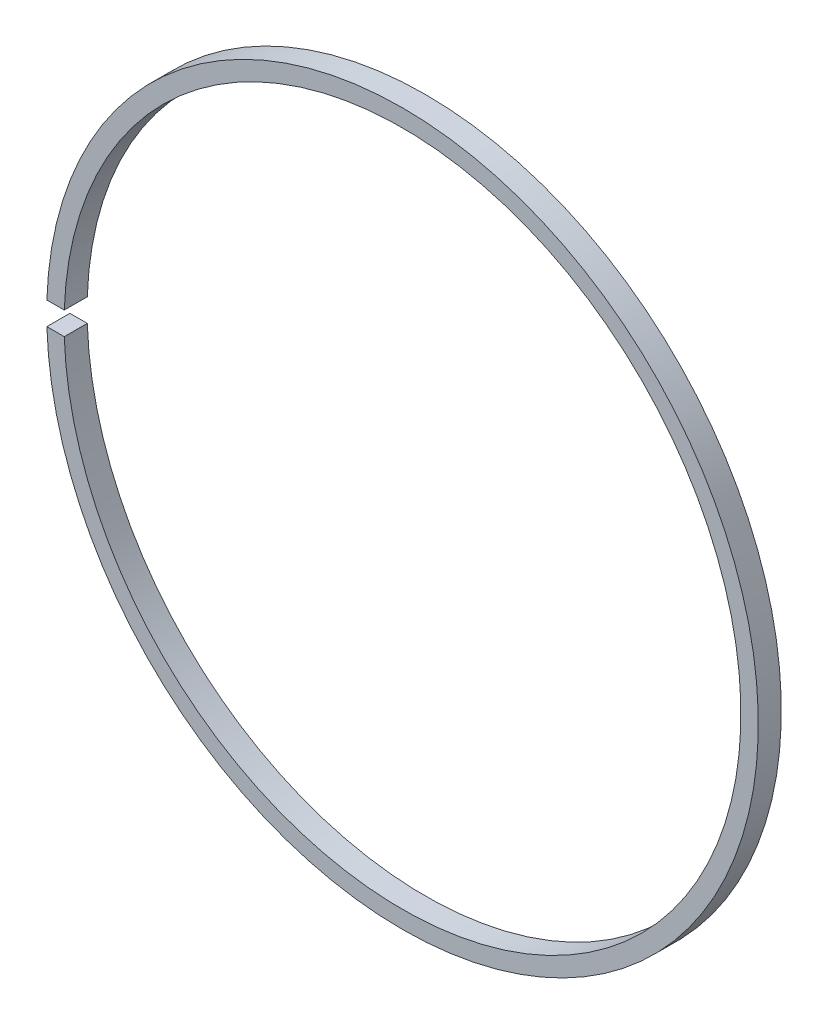
ISO-10303-21;
HEADER;
FILE_DESCRIPTION(('STEP AP214'),'2;1');
FILE_NAME('part.step','',(''),(''),'','','');
FILE_SCHEMA(('AUTOMOTIVE_DESIGN { 1 0 10303 214 1 1 1 1 }'));
ENDSEC;
DATA;
#1=APPLICATION_CONTEXT('core data for automotive mechanical design processes');
#2=APPLICATION_PROTOCOL_DEFINITION('international standard','automotive_design',2000,#1);
#3=PRODUCT_CONTEXT('',#1,'mechanical');
#4=PRODUCT('Part','Part','',(#3));
#5=PRODUCT_RELATED_PRODUCT_CATEGORY('part','',(#4));
#6=PRODUCT_DEFINITION_FORMATION('','',#4);
#7=PRODUCT_DEFINITION_CONTEXT('part definition',#1,'design');
#8=PRODUCT_DEFINITION('design','',#6,#7);
#9=PRODUCT_DEFINITION_SHAPE('','',#8);
#10=(LENGTH_UNIT() NAMED_UNIT(*) SI_UNIT(.MILLI.,.METRE.));
#11=(NAMED_UNIT(*) PLANE_ANGLE_UNIT() SI_UNIT($,.RADIAN.));
#12=(NAMED_UNIT(*) SI_UNIT($,.STERADIAN.) SOLID_ANGLE_UNIT());
#13=UNCERTAINTY_MEASURE_WITH_UNIT(LENGTH_MEASURE(1.E-05),#10,'distance_accuracy_value','');
#14=(GEOMETRIC_REPRESENTATION_CONTEXT(3) GLOBAL_UNCERTAINTY_ASSIGNED_CONTEXT((#13)) GLOBAL_UNIT_ASSIGNED_CONTEXT((#10,
#11,#12)) REPRESENTATION_CONTEXT('',''));
#15=CARTESIAN_POINT('',(0.,0.,0.));
#16=DIRECTION('',(0.,0.,1.));
#17=DIRECTION('',(1.,0.,0.));
#18=AXIS2_PLACEMENT_3D('',#15,#16,#17);
#19=CARTESIAN_POINT('',(0.,0.,3.175));
#20=DIRECTION('',(0.,0.,1.));
#21=DIRECTION('',(1.,0.,0.));
#22=AXIS2_PLACEMENT_3D('',#19,#20,#21);
#23=PLANE('',#22);
#24=DIRECTION('',(1.,0.,0.));
#25=VECTOR('',#24,1.);
#26=CARTESIAN_POINT('',(0.,1.58749999999999,3.175));
#27=LINE('',#26,#25);
#28=CARTESIAN_POINT('',(-49.0598221969872,1.58750000000001,3.175));
#29=VERTEX_POINT('',#28);
#30=CARTESIAN_POINT('',(-46.6582012382604,1.58750000000001,3.175));
#31=VERTEX_POINT('',#30);
#32=EDGE_CURVE('E114',#29,#31,#27,.T.);
#33=ORIENTED_EDGE('',*,*,#32,.T.);
#34=CARTESIAN_POINT('',(0.,0.,3.175));
#35=DIRECTION('',(0.,0.,1.));
#36=DIRECTION('',(1.,0.,0.));
#37=AXIS2_PLACEMENT_3D('',#34,#35,#36);
#38=CIRCLE('',#37,46.6852);
#39=CARTESIAN_POINT('',(-46.6582012382604,-1.58749999999999,3.175));
#40=VERTEX_POINT('',#39);
#41=EDGE_CURVE('E97',#40,#31,#38,.T.);
#42=ORIENTED_EDGE('',*,*,#41,.F.);
#43=DIRECTION('',(-1.,0.,0.));
#44=VECTOR('',#43,1.);
#45=CARTESIAN_POINT('',(0.,-1.58749999999999,3.175));
#46=LINE('',#45,#44);
#47=CARTESIAN_POINT('',(-49.0598221969872,-1.58749999999999,3.175));
#48=VERTEX_POINT('',#47);
#49=EDGE_CURVE('E61',#40,#48,#46,.T.);
#50=ORIENTED_EDGE('',*,*,#49,.T.);
#51=CARTESIAN_POINT('',(0.,0.,3.175));
#52=DIRECTION('',(0.,0.,1.));
#53=DIRECTION('',(1.,0.,0.));
#54=AXIS2_PLACEMENT_3D('',#51,#52,#53);
#55=CIRCLE('',#54,49.0855);
#56=EDGE_CURVE('E85',#48,#29,#55,.T.);
#57=ORIENTED_EDGE('',*,*,#56,.T.);
#58=EDGE_LOOP('',(#33,#42,#50,#57));
#59=FACE_BOUND('',#58,.T.);
#60=ADVANCED_FACE('F38',(#59),#23,.T.);
#61=CARTESIAN_POINT('',(0.,0.,0.));
#62=DIRECTION('',(0.,0.,1.));
#63=DIRECTION('',(1.,0.,0.));
#64=AXIS2_PLACEMENT_3D('',#61,#62,#63);
#65=PLANE('',#64);
#66=CARTESIAN_POINT('',(0.,0.,0.));
#67=DIRECTION('',(0.,0.,1.));
#68=DIRECTION('',(1.,0.,0.));
#69=AXIS2_PLACEMENT_3D('',#66,#67,#68);
#70=CIRCLE('',#69,46.6852);
#71=CARTESIAN_POINT('',(-46.6582012382604,-1.58749999999999,0.));
#72=VERTEX_POINT('',#71);
#73=CARTESIAN_POINT('',(-46.6582012382604,1.58750000000001,0.));
#74=VERTEX_POINT('',#73);
#75=EDGE_CURVE('E90',#72,#74,#70,.T.);
#76=ORIENTED_EDGE('',*,*,#75,.T.);
#77=DIRECTION('',(1.,0.,0.));
#78=VECTOR('',#77,1.);
#79=CARTESIAN_POINT('',(0.,1.58749999999999,0.));
#80=LINE('',#79,#78);
#81=CARTESIAN_POINT('',(-49.0598221969872,1.58750000000001,0.));
#82=VERTEX_POINT('',#81);
#83=EDGE_CURVE('E53',#82,#74,#80,.T.);
#84=ORIENTED_EDGE('',*,*,#83,.F.);
#85=CARTESIAN_POINT('',(0.,0.,0.));
#86=DIRECTION('',(0.,0.,1.));
#87=DIRECTION('',(1.,0.,0.));
#88=AXIS2_PLACEMENT_3D('',#85,#86,#87);
#89=CIRCLE('',#88,49.0855);
#90=CARTESIAN_POINT('',(-49.0598221969872,-1.58749999999999,0.));
#91=VERTEX_POINT('',#90);
#92=EDGE_CURVE('E92',#91,#82,#89,.T.);
#93=ORIENTED_EDGE('',*,*,#92,.F.);
#94=DIRECTION('',(-1.,0.,0.));
#95=VECTOR('',#94,1.);
#96=CARTESIAN_POINT('',(0.,-1.58749999999999,0.));
#97=LINE('',#96,#95);
#98=EDGE_CURVE('E78',#72,#91,#97,.T.);
#99=ORIENTED_EDGE('',*,*,#98,.F.);
#100=EDGE_LOOP('',(#76,#84,#93,#99));
#101=FACE_BOUND('',#100,.T.);
#102=ADVANCED_FACE('F89',(#101),#65,.F.);
#103=CARTESIAN_POINT('',(0.,0.,3.175));
#104=DIRECTION('',(0.,0.,-1.));
#105=DIRECTION('',(-1.,0.,0.));
#106=AXIS2_PLACEMENT_3D('',#103,#104,#105);
#107=CYLINDRICAL_SURFACE('',#106,49.0855);
#108=ORIENTED_EDGE('',*,*,#92,.T.);
#109=DIRECTION('',(0.,0.,-1.));
#110=VECTOR('',#109,1.);
#111=CARTESIAN_POINT('',(-49.0598221969872,1.58750000000001,3.175));
#112=LINE('',#111,#110);
#113=EDGE_CURVE('E98',#82,#29,#112,.F.);
#114=ORIENTED_EDGE('',*,*,#113,.T.);
#115=ORIENTED_EDGE('',*,*,#56,.F.);
#116=DIRECTION('',(0.,0.,-1.));
#117=VECTOR('',#116,1.);
#118=CARTESIAN_POINT('',(-49.0598221969872,-1.58749999999999,3.175));
#119=LINE('',#118,#117);
#120=EDGE_CURVE('E104',#48,#91,#119,.T.);
#121=ORIENTED_EDGE('',*,*,#120,.T.);
#122=EDGE_LOOP('',(#108,#114,#115,#121));
#123=FACE_BOUND('',#122,.T.);
#124=ADVANCED_FACE('F40',(#123),#107,.T.);
#125=CARTESIAN_POINT('',(0.,0.,3.175));
#126=DIRECTION('',(0.,0.,-1.));
#127=DIRECTION('',(-1.,0.,0.));
#128=AXIS2_PLACEMENT_3D('',#125,#126,#127);
#129=CYLINDRICAL_SURFACE('',#128,46.6852);
#130=DIRECTION('',(0.,0.,-1.));
#131=VECTOR('',#130,1.);
#132=CARTESIAN_POINT('',(-46.6582012382604,1.58750000000001,3.175));
#133=LINE('',#132,#131);
#134=EDGE_CURVE('E11',#74,#31,#133,.F.);
#135=ORIENTED_EDGE('',*,*,#134,.F.);
#136=ORIENTED_EDGE('',*,*,#75,.F.);
#137=DIRECTION('',(0.,0.,-1.));
#138=VECTOR('',#137,1.);
#139=CARTESIAN_POINT('',(-46.6582012382604,-1.58749999999999,3.175));
#140=LINE('',#139,#138);
#141=EDGE_CURVE('E47',#40,#72,#140,.T.);
#142=ORIENTED_EDGE('',*,*,#141,.F.);
#143=ORIENTED_EDGE('',*,*,#41,.T.);
#144=EDGE_LOOP('',(#135,#136,#142,#143));
#145=FACE_BOUND('',#144,.T.);
#146=ADVANCED_FACE('F95',(#145),#129,.F.);
#147=CARTESIAN_POINT('',(0.,-1.58749999999999,3.175));
#148=DIRECTION('',(0.,-1.,0.));
#149=DIRECTION('',(0.,0.,-1.));
#150=AXIS2_PLACEMENT_3D('',#147,#148,#149);
#151=PLANE('',#150);
#152=ORIENTED_EDGE('',*,*,#49,.F.);
#153=ORIENTED_EDGE('',*,*,#141,.T.);
#154=ORIENTED_EDGE('',*,*,#98,.T.);
#155=ORIENTED_EDGE('',*,*,#120,.F.);
#156=EDGE_LOOP('',(#152,#153,#154,#155));
#157=FACE_BOUND('',#156,.T.);
#158=ADVANCED_FACE('F77',(#157),#151,.F.);
#159=CARTESIAN_POINT('',(0.,1.58749999999999,3.175));
#160=DIRECTION('',(0.,1.,0.));
#161=DIRECTION('',(-1.,0.,0.));
#162=AXIS2_PLACEMENT_3D('',#159,#160,#161);
#163=PLANE('',#162);
#164=ORIENTED_EDGE('',*,*,#83,.T.);
#165=ORIENTED_EDGE('',*,*,#134,.T.);
#166=ORIENTED_EDGE('',*,*,#32,.F.);
#167=ORIENTED_EDGE('',*,*,#113,.F.);
#168=EDGE_LOOP('',(#164,#165,#166,#167));
#169=FACE_BOUND('',#168,.T.);
#170=ADVANCED_FACE('F124',(#169),#163,.F.);
#171=CLOSED_SHELL('',(#60,#102,#124,#146,#158,#170));
#172=MANIFOLD_SOLID_BREP('B2',#171);
#173=ADVANCED_BREP_SHAPE_REPRESENTATION('',(#18,#172),#14);
#174=SHAPE_DEFINITION_REPRESENTATION(#9,#173);
ENDSEC;
END-ISO-10303-21;
